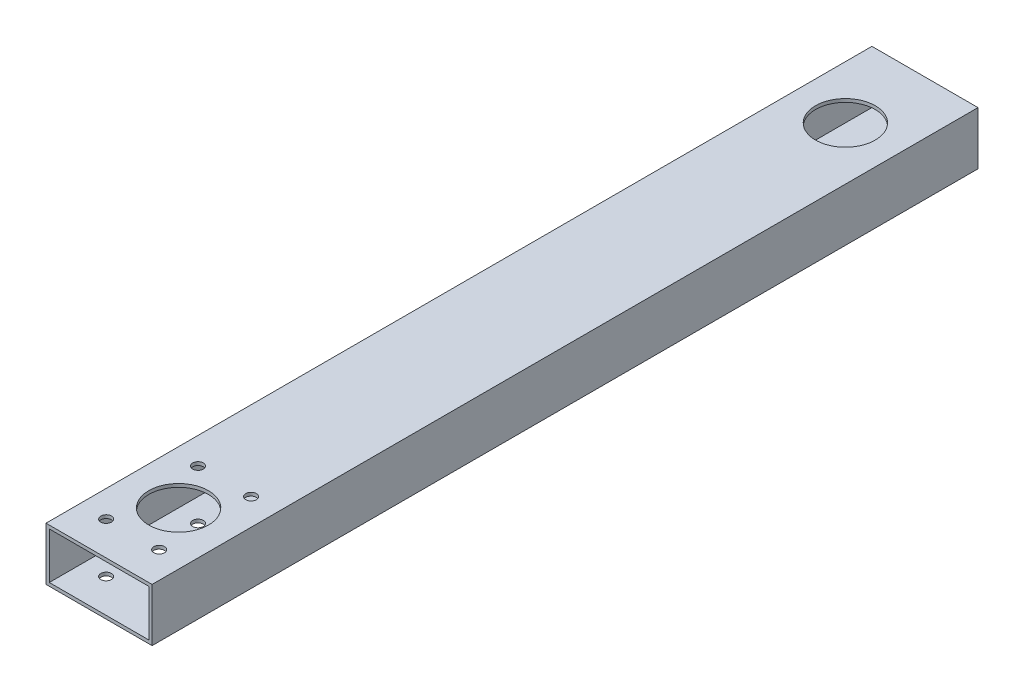
ISO-10303-21;
HEADER;
FILE_DESCRIPTION(('STEP AP214'),'2;1');
FILE_NAME('part.step','',(''),(''),'','','');
FILE_SCHEMA(('AUTOMOTIVE_DESIGN { 1 0 10303 214 1 1 1 1 }'));
ENDSEC;
DATA;
#1=APPLICATION_CONTEXT('core data for automotive mechanical design processes');
#2=APPLICATION_PROTOCOL_DEFINITION('international standard','automotive_design',2000,#1);
#3=PRODUCT_CONTEXT('',#1,'mechanical');
#4=PRODUCT('Part','Part','',(#3));
#5=PRODUCT_RELATED_PRODUCT_CATEGORY('part','',(#4));
#6=PRODUCT_DEFINITION_FORMATION('','',#4);
#7=PRODUCT_DEFINITION_CONTEXT('part definition',#1,'design');
#8=PRODUCT_DEFINITION('design','',#6,#7);
#9=PRODUCT_DEFINITION_SHAPE('','',#8);
#10=(LENGTH_UNIT() NAMED_UNIT(*) SI_UNIT(.MILLI.,.METRE.));
#11=(NAMED_UNIT(*) PLANE_ANGLE_UNIT() SI_UNIT($,.RADIAN.));
#12=(NAMED_UNIT(*) SI_UNIT($,.STERADIAN.) SOLID_ANGLE_UNIT());
#13=UNCERTAINTY_MEASURE_WITH_UNIT(LENGTH_MEASURE(1.E-05),#10,'distance_accuracy_value','');
#14=(GEOMETRIC_REPRESENTATION_CONTEXT(3) GLOBAL_UNCERTAINTY_ASSIGNED_CONTEXT((#13)) GLOBAL_UNIT_ASSIGNED_CONTEXT((#10,
#11,#12)) REPRESENTATION_CONTEXT('',''));
#15=CARTESIAN_POINT('',(0.,0.,0.));
#16=DIRECTION('',(0.,0.,1.));
#17=DIRECTION('',(1.,0.,0.));
#18=AXIS2_PLACEMENT_3D('',#15,#16,#17);
#19=CARTESIAN_POINT('',(655.574,1437.40214385304,555.397045256125));
#20=DIRECTION('',(0.,-1.,0.));
#21=DIRECTION('',(0.,0.,-1.));
#22=AXIS2_PLACEMENT_3D('',#19,#20,#21);
#23=CYLINDRICAL_SURFACE('',#22,2.55270000000004);
#24=CARTESIAN_POINT('',(655.574,-26.19375,555.397045256125));
#25=DIRECTION('',(0.,-1.,0.));
#26=DIRECTION('',(0.,0.,-1.));
#27=AXIS2_PLACEMENT_3D('',#24,#25,#26);
#28=CIRCLE('',#27,2.55270000000004);
#29=CARTESIAN_POINT('',(655.574,-26.19375,552.844345256125));
#30=VERTEX_POINT('',#29);
#31=EDGE_CURVE('E291',#30,#30,#28,.T.);
#32=ORIENTED_EDGE('',*,*,#31,.F.);
#33=EDGE_LOOP('',(#32));
#34=FACE_BOUND('',#33,.T.);
#35=CARTESIAN_POINT('',(655.574,-27.78125,555.397045256125));
#36=DIRECTION('',(0.,-1.,0.));
#37=DIRECTION('',(0.,0.,-1.));
#38=AXIS2_PLACEMENT_3D('',#35,#36,#37);
#39=CIRCLE('',#38,2.55270000000004);
#40=CARTESIAN_POINT('',(655.574,-27.78125,552.844345256125));
#41=VERTEX_POINT('',#40);
#42=EDGE_CURVE('E334',#41,#41,#39,.T.);
#43=ORIENTED_EDGE('',*,*,#42,.T.);
#44=EDGE_LOOP('',(#43));
#45=FACE_BOUND('',#44,.T.);
#46=ADVANCED_FACE('F17',(#34,#45),#23,.F.);
#47=CARTESIAN_POINT('',(680.974,1437.40214385304,555.397045256125));
#48=DIRECTION('',(0.,-1.,0.));
#49=DIRECTION('',(0.,0.,-1.));
#50=AXIS2_PLACEMENT_3D('',#47,#48,#49);
#51=CYLINDRICAL_SURFACE('',#50,2.55270000000004);
#52=CARTESIAN_POINT('',(680.974,-26.19375,555.397045256125));
#53=DIRECTION('',(0.,-1.,0.));
#54=DIRECTION('',(0.,0.,-1.));
#55=AXIS2_PLACEMENT_3D('',#52,#53,#54);
#56=CIRCLE('',#55,2.55270000000004);
#57=CARTESIAN_POINT('',(680.974,-26.19375,552.844345256125));
#58=VERTEX_POINT('',#57);
#59=EDGE_CURVE('E268',#58,#58,#56,.T.);
#60=ORIENTED_EDGE('',*,*,#59,.F.);
#61=EDGE_LOOP('',(#60));
#62=FACE_BOUND('',#61,.T.);
#63=CARTESIAN_POINT('',(680.974,-27.78125,555.397045256125));
#64=DIRECTION('',(0.,-1.,0.));
#65=DIRECTION('',(0.,0.,-1.));
#66=AXIS2_PLACEMENT_3D('',#63,#64,#65);
#67=CIRCLE('',#66,2.55270000000004);
#68=CARTESIAN_POINT('',(680.974,-27.78125,552.844345256125));
#69=VERTEX_POINT('',#68);
#70=EDGE_CURVE('E339',#69,#69,#67,.T.);
#71=ORIENTED_EDGE('',*,*,#70,.T.);
#72=EDGE_LOOP('',(#71));
#73=FACE_BOUND('',#72,.T.);
#74=ADVANCED_FACE('F402',(#62,#73),#51,.F.);
#75=CARTESIAN_POINT('',(680.974,1437.40214385304,511.402954743875));
#76=DIRECTION('',(0.,-1.,0.));
#77=DIRECTION('',(0.,0.,-1.));
#78=AXIS2_PLACEMENT_3D('',#75,#76,#77);
#79=CYLINDRICAL_SURFACE('',#78,2.55270000000004);
#80=CARTESIAN_POINT('',(680.974,-26.19375,511.402954743875));
#81=DIRECTION('',(0.,-1.,0.));
#82=DIRECTION('',(0.,0.,-1.));
#83=AXIS2_PLACEMENT_3D('',#80,#81,#82);
#84=CIRCLE('',#83,2.55270000000004);
#85=CARTESIAN_POINT('',(680.974,-26.19375,508.850254743875));
#86=VERTEX_POINT('',#85);
#87=EDGE_CURVE('E264',#86,#86,#84,.T.);
#88=ORIENTED_EDGE('',*,*,#87,.F.);
#89=EDGE_LOOP('',(#88));
#90=FACE_BOUND('',#89,.T.);
#91=CARTESIAN_POINT('',(680.974,-27.78125,511.402954743875));
#92=DIRECTION('',(0.,-1.,0.));
#93=DIRECTION('',(0.,0.,-1.));
#94=AXIS2_PLACEMENT_3D('',#91,#92,#93);
#95=CIRCLE('',#94,2.55270000000004);
#96=CARTESIAN_POINT('',(680.974,-27.78125,508.850254743875));
#97=VERTEX_POINT('',#96);
#98=EDGE_CURVE('E342',#97,#97,#95,.T.);
#99=ORIENTED_EDGE('',*,*,#98,.T.);
#100=EDGE_LOOP('',(#99));
#101=FACE_BOUND('',#100,.T.);
#102=ADVANCED_FACE('F407',(#90,#101),#79,.F.);
#103=CARTESIAN_POINT('',(655.574,1437.40214385304,511.402954743875));
#104=DIRECTION('',(0.,-1.,0.));
#105=DIRECTION('',(0.,0.,-1.));
#106=AXIS2_PLACEMENT_3D('',#103,#104,#105);
#107=CYLINDRICAL_SURFACE('',#106,2.55270000000004);
#108=CARTESIAN_POINT('',(655.574,-26.19375,511.402954743875));
#109=DIRECTION('',(0.,-1.,0.));
#110=DIRECTION('',(0.,0.,-1.));
#111=AXIS2_PLACEMENT_3D('',#108,#109,#110);
#112=CIRCLE('',#111,2.55270000000004);
#113=CARTESIAN_POINT('',(655.574,-26.19375,508.850254743875));
#114=VERTEX_POINT('',#113);
#115=EDGE_CURVE('E267',#114,#114,#112,.T.);
#116=ORIENTED_EDGE('',*,*,#115,.F.);
#117=EDGE_LOOP('',(#116));
#118=FACE_BOUND('',#117,.T.);
#119=CARTESIAN_POINT('',(655.574,-27.78125,511.402954743875));
#120=DIRECTION('',(0.,-1.,0.));
#121=DIRECTION('',(0.,0.,-1.));
#122=AXIS2_PLACEMENT_3D('',#119,#120,#121);
#123=CIRCLE('',#122,2.55270000000004);
#124=CARTESIAN_POINT('',(655.574,-27.78125,508.850254743875));
#125=VERTEX_POINT('',#124);
#126=EDGE_CURVE('E345',#125,#125,#123,.T.);
#127=ORIENTED_EDGE('',*,*,#126,.T.);
#128=EDGE_LOOP('',(#127));
#129=FACE_BOUND('',#128,.T.);
#130=ADVANCED_FACE('F444',(#118,#129),#107,.F.);
#131=CARTESIAN_POINT('',(668.274,1437.40214385304,533.4));
#132=DIRECTION('',(0.,-1.,0.));
#133=DIRECTION('',(0.,0.,-1.));
#134=AXIS2_PLACEMENT_3D('',#131,#132,#133);
#135=CYLINDRICAL_SURFACE('',#134,14.2875);
#136=CARTESIAN_POINT('',(668.274,-26.19375,533.4));
#137=DIRECTION('',(0.,-1.,0.));
#138=DIRECTION('',(0.,0.,-1.));
#139=AXIS2_PLACEMENT_3D('',#136,#137,#138);
#140=CIRCLE('',#139,14.2875);
#141=CARTESIAN_POINT('',(668.274,-26.19375,519.1125));
#142=VERTEX_POINT('',#141);
#143=EDGE_CURVE('E303',#142,#142,#140,.T.);
#144=ORIENTED_EDGE('',*,*,#143,.F.);
#145=EDGE_LOOP('',(#144));
#146=FACE_BOUND('',#145,.T.);
#147=CARTESIAN_POINT('',(668.274,-27.78125,533.4));
#148=DIRECTION('',(0.,-1.,0.));
#149=DIRECTION('',(0.,0.,-1.));
#150=AXIS2_PLACEMENT_3D('',#147,#148,#149);
#151=CIRCLE('',#150,14.2875);
#152=CARTESIAN_POINT('',(668.274,-27.78125,519.1125));
#153=VERTEX_POINT('',#152);
#154=EDGE_CURVE('E348',#153,#153,#151,.T.);
#155=ORIENTED_EDGE('',*,*,#154,.T.);
#156=EDGE_LOOP('',(#155));
#157=FACE_BOUND('',#156,.T.);
#158=ADVANCED_FACE('F395',(#146,#157),#135,.F.);
#159=CARTESIAN_POINT('',(668.274,1437.40214385304,214.122));
#160=DIRECTION('',(0.,-1.,0.));
#161=DIRECTION('',(0.,0.,-1.));
#162=AXIS2_PLACEMENT_3D('',#159,#160,#161);
#163=CYLINDRICAL_SURFACE('',#162,14.2875);
#164=CARTESIAN_POINT('',(668.274,-26.19375,214.122));
#165=DIRECTION('',(0.,-1.,0.));
#166=DIRECTION('',(0.,0.,-1.));
#167=AXIS2_PLACEMENT_3D('',#164,#165,#166);
#168=CIRCLE('',#167,14.2875);
#169=CARTESIAN_POINT('',(668.274,-26.19375,199.8345));
#170=VERTEX_POINT('',#169);
#171=EDGE_CURVE('E306',#170,#170,#168,.T.);
#172=ORIENTED_EDGE('',*,*,#171,.F.);
#173=EDGE_LOOP('',(#172));
#174=FACE_BOUND('',#173,.T.);
#175=CARTESIAN_POINT('',(668.274,-27.78125,214.122));
#176=DIRECTION('',(0.,-1.,0.));
#177=DIRECTION('',(0.,0.,-1.));
#178=AXIS2_PLACEMENT_3D('',#175,#176,#177);
#179=CIRCLE('',#178,14.2875);
#180=CARTESIAN_POINT('',(668.274,-27.78125,199.8345));
#181=VERTEX_POINT('',#180);
#182=EDGE_CURVE('E351',#181,#181,#179,.T.);
#183=ORIENTED_EDGE('',*,*,#182,.T.);
#184=EDGE_LOOP('',(#183));
#185=FACE_BOUND('',#184,.T.);
#186=ADVANCED_FACE('F385',(#174,#185),#163,.F.);
#187=CARTESIAN_POINT('',(655.574,1437.40214385304,555.397045256125));
#188=DIRECTION('',(0.,-1.,0.));
#189=DIRECTION('',(0.,0.,-1.));
#190=AXIS2_PLACEMENT_3D('',#187,#188,#189);
#191=CYLINDRICAL_SURFACE('',#190,2.55270000000004);
#192=CARTESIAN_POINT('',(655.574,-50.00625,555.397045256125));
#193=DIRECTION('',(0.,-1.,0.));
#194=DIRECTION('',(0.,0.,-1.));
#195=AXIS2_PLACEMENT_3D('',#192,#193,#194);
#196=CIRCLE('',#195,2.55270000000004);
#197=CARTESIAN_POINT('',(655.574,-50.00625,552.844345256125));
#198=VERTEX_POINT('',#197);
#199=EDGE_CURVE('E354',#198,#198,#196,.T.);
#200=ORIENTED_EDGE('',*,*,#199,.F.);
#201=EDGE_LOOP('',(#200));
#202=FACE_BOUND('',#201,.T.);
#203=CARTESIAN_POINT('',(655.574,-51.59375,555.397045256125));
#204=DIRECTION('',(0.,-1.,0.));
#205=DIRECTION('',(0.,0.,-1.));
#206=AXIS2_PLACEMENT_3D('',#203,#204,#205);
#207=CIRCLE('',#206,2.55270000000004);
#208=CARTESIAN_POINT('',(655.574,-51.59375,552.844345256125));
#209=VERTEX_POINT('',#208);
#210=EDGE_CURVE('E309',#209,#209,#207,.T.);
#211=ORIENTED_EDGE('',*,*,#210,.T.);
#212=EDGE_LOOP('',(#211));
#213=FACE_BOUND('',#212,.T.);
#214=ADVANCED_FACE('F383',(#202,#213),#191,.F.);
#215=CARTESIAN_POINT('',(680.974,1437.40214385304,555.397045256125));
#216=DIRECTION('',(0.,-1.,0.));
#217=DIRECTION('',(0.,0.,-1.));
#218=AXIS2_PLACEMENT_3D('',#215,#216,#217);
#219=CYLINDRICAL_SURFACE('',#218,2.55270000000004);
#220=CARTESIAN_POINT('',(680.974,-50.00625,555.397045256125));
#221=DIRECTION('',(0.,-1.,0.));
#222=DIRECTION('',(0.,0.,-1.));
#223=AXIS2_PLACEMENT_3D('',#220,#221,#222);
#224=CIRCLE('',#223,2.55270000000004);
#225=CARTESIAN_POINT('',(680.974,-50.00625,552.844345256125));
#226=VERTEX_POINT('',#225);
#227=EDGE_CURVE('E357',#226,#226,#224,.T.);
#228=ORIENTED_EDGE('',*,*,#227,.F.);
#229=EDGE_LOOP('',(#228));
#230=FACE_BOUND('',#229,.T.);
#231=CARTESIAN_POINT('',(680.974,-51.59375,555.397045256125));
#232=DIRECTION('',(0.,-1.,0.));
#233=DIRECTION('',(0.,0.,-1.));
#234=AXIS2_PLACEMENT_3D('',#231,#232,#233);
#235=CIRCLE('',#234,2.55270000000004);
#236=CARTESIAN_POINT('',(680.974,-51.59375,552.844345256125));
#237=VERTEX_POINT('',#236);
#238=EDGE_CURVE('E300',#237,#237,#235,.T.);
#239=ORIENTED_EDGE('',*,*,#238,.T.);
#240=EDGE_LOOP('',(#239));
#241=FACE_BOUND('',#240,.T.);
#242=ADVANCED_FACE('F370',(#230,#241),#219,.F.);
#243=CARTESIAN_POINT('',(680.974,1437.40214385304,511.402954743875));
#244=DIRECTION('',(0.,-1.,0.));
#245=DIRECTION('',(0.,0.,-1.));
#246=AXIS2_PLACEMENT_3D('',#243,#244,#245);
#247=CYLINDRICAL_SURFACE('',#246,2.55270000000004);
#248=CARTESIAN_POINT('',(680.974,-50.00625,511.402954743875));
#249=DIRECTION('',(0.,-1.,0.));
#250=DIRECTION('',(0.,0.,-1.));
#251=AXIS2_PLACEMENT_3D('',#248,#249,#250);
#252=CIRCLE('',#251,2.55270000000004);
#253=CARTESIAN_POINT('',(680.974,-50.00625,508.850254743875));
#254=VERTEX_POINT('',#253);
#255=EDGE_CURVE('E237',#254,#254,#252,.T.);
#256=ORIENTED_EDGE('',*,*,#255,.F.);
#257=EDGE_LOOP('',(#256));
#258=FACE_BOUND('',#257,.T.);
#259=CARTESIAN_POINT('',(680.974,-51.59375,511.402954743875));
#260=DIRECTION('',(0.,-1.,0.));
#261=DIRECTION('',(0.,0.,-1.));
#262=AXIS2_PLACEMENT_3D('',#259,#260,#261);
#263=CIRCLE('',#262,2.55270000000004);
#264=CARTESIAN_POINT('',(680.974,-51.59375,508.850254743875));
#265=VERTEX_POINT('',#264);
#266=EDGE_CURVE('E296',#265,#265,#263,.T.);
#267=ORIENTED_EDGE('',*,*,#266,.T.);
#268=EDGE_LOOP('',(#267));
#269=FACE_BOUND('',#268,.T.);
#270=ADVANCED_FACE('F366',(#258,#269),#247,.F.);
#271=CARTESIAN_POINT('',(655.574,1437.40214385304,511.402954743875));
#272=DIRECTION('',(0.,-1.,0.));
#273=DIRECTION('',(0.,0.,-1.));
#274=AXIS2_PLACEMENT_3D('',#271,#272,#273);
#275=CYLINDRICAL_SURFACE('',#274,2.55270000000004);
#276=CARTESIAN_POINT('',(655.574,-50.00625,511.402954743875));
#277=DIRECTION('',(0.,-1.,0.));
#278=DIRECTION('',(0.,0.,-1.));
#279=AXIS2_PLACEMENT_3D('',#276,#277,#278);
#280=CIRCLE('',#279,2.55270000000004);
#281=CARTESIAN_POINT('',(655.574,-50.00625,508.850254743875));
#282=VERTEX_POINT('',#281);
#283=EDGE_CURVE('E235',#282,#282,#280,.T.);
#284=ORIENTED_EDGE('',*,*,#283,.F.);
#285=EDGE_LOOP('',(#284));
#286=FACE_BOUND('',#285,.T.);
#287=CARTESIAN_POINT('',(655.574,-51.59375,511.402954743875));
#288=DIRECTION('',(0.,-1.,0.));
#289=DIRECTION('',(0.,0.,-1.));
#290=AXIS2_PLACEMENT_3D('',#287,#288,#289);
#291=CIRCLE('',#290,2.55270000000004);
#292=CARTESIAN_POINT('',(655.574,-51.59375,508.850254743875));
#293=VERTEX_POINT('',#292);
#294=EDGE_CURVE('E299',#293,#293,#291,.T.);
#295=ORIENTED_EDGE('',*,*,#294,.T.);
#296=EDGE_LOOP('',(#295));
#297=FACE_BOUND('',#296,.T.);
#298=ADVANCED_FACE('F369',(#286,#297),#275,.F.);
#299=CARTESIAN_POINT('',(668.274,1437.40214385304,533.4));
#300=DIRECTION('',(0.,-1.,0.));
#301=DIRECTION('',(0.,0.,-1.));
#302=AXIS2_PLACEMENT_3D('',#299,#300,#301);
#303=CYLINDRICAL_SURFACE('',#302,14.2875);
#304=CARTESIAN_POINT('',(668.274,-50.00625,533.4));
#305=DIRECTION('',(0.,-1.,0.));
#306=DIRECTION('',(0.,0.,-1.));
#307=AXIS2_PLACEMENT_3D('',#304,#305,#306);
#308=CIRCLE('',#307,14.2875);
#309=CARTESIAN_POINT('',(668.274,-50.00625,519.1125));
#310=VERTEX_POINT('',#309);
#311=EDGE_CURVE('E25',#310,#310,#308,.T.);
#312=ORIENTED_EDGE('',*,*,#311,.F.);
#313=EDGE_LOOP('',(#312));
#314=FACE_BOUND('',#313,.T.);
#315=CARTESIAN_POINT('',(668.274,-51.59375,533.4));
#316=DIRECTION('',(0.,-1.,0.));
#317=DIRECTION('',(0.,0.,-1.));
#318=AXIS2_PLACEMENT_3D('',#315,#316,#317);
#319=CIRCLE('',#318,14.2875);
#320=CARTESIAN_POINT('',(668.274,-51.59375,519.1125));
#321=VERTEX_POINT('',#320);
#322=EDGE_CURVE('E310',#321,#321,#319,.T.);
#323=ORIENTED_EDGE('',*,*,#322,.T.);
#324=EDGE_LOOP('',(#323));
#325=FACE_BOUND('',#324,.T.);
#326=ADVANCED_FACE('F433',(#314,#325),#303,.F.);
#327=CARTESIAN_POINT('',(668.274,1437.40214385304,214.122));
#328=DIRECTION('',(0.,-1.,0.));
#329=DIRECTION('',(0.,0.,-1.));
#330=AXIS2_PLACEMENT_3D('',#327,#328,#329);
#331=CYLINDRICAL_SURFACE('',#330,14.2875);
#332=CARTESIAN_POINT('',(668.274,-50.00625,214.122));
#333=DIRECTION('',(0.,-1.,0.));
#334=DIRECTION('',(0.,0.,-1.));
#335=AXIS2_PLACEMENT_3D('',#332,#333,#334);
#336=CIRCLE('',#335,14.2875);
#337=CARTESIAN_POINT('',(668.274,-50.00625,199.8345));
#338=VERTEX_POINT('',#337);
#339=EDGE_CURVE('E11',#338,#338,#336,.T.);
#340=ORIENTED_EDGE('',*,*,#339,.F.);
#341=EDGE_LOOP('',(#340));
#342=FACE_BOUND('',#341,.T.);
#343=CARTESIAN_POINT('',(668.274,-51.59375,214.122));
#344=DIRECTION('',(0.,-1.,0.));
#345=DIRECTION('',(0.,0.,-1.));
#346=AXIS2_PLACEMENT_3D('',#343,#344,#345);
#347=CIRCLE('',#346,14.2875);
#348=CARTESIAN_POINT('',(668.274,-51.59375,199.8345));
#349=VERTEX_POINT('',#348);
#350=EDGE_CURVE('E313',#349,#349,#347,.T.);
#351=ORIENTED_EDGE('',*,*,#350,.T.);
#352=EDGE_LOOP('',(#351));
#353=FACE_BOUND('',#352,.T.);
#354=ADVANCED_FACE('F424',(#342,#353),#331,.F.);
#355=CARTESIAN_POINT('',(564.7055,-50.00625,481.683357143497));
#356=DIRECTION('',(0.,-1.,0.));
#357=DIRECTION('',(0.,0.,-1.));
#358=AXIS2_PLACEMENT_3D('',#355,#356,#357);
#359=PLANE('',#358);
#360=DIRECTION('',(0.,0.,-1.));
#361=VECTOR('',#360,1.);
#362=CARTESIAN_POINT('',(644.4615,-50.00625,481.683357143497));
#363=LINE('',#362,#361);
#364=CARTESIAN_POINT('',(644.4615,-50.00625,571.5));
#365=VERTEX_POINT('',#364);
#366=CARTESIAN_POINT('',(644.4615,-50.00625,176.022));
#367=VERTEX_POINT('',#366);
#368=EDGE_CURVE('E322',#365,#367,#363,.T.);
#369=ORIENTED_EDGE('',*,*,#368,.F.);
#370=DIRECTION('',(1.,0.,0.));
#371=VECTOR('',#370,1.);
#372=CARTESIAN_POINT('',(564.7055,-50.00625,571.5));
#373=LINE('',#372,#371);
#374=CARTESIAN_POINT('',(692.0865,-50.00625,571.5));
#375=VERTEX_POINT('',#374);
#376=EDGE_CURVE('E250',#365,#375,#373,.T.);
#377=ORIENTED_EDGE('',*,*,#376,.T.);
#378=DIRECTION('',(0.,0.,-1.));
#379=VECTOR('',#378,1.);
#380=CARTESIAN_POINT('',(692.0865,-50.00625,481.683357143497));
#381=LINE('',#380,#379);
#382=CARTESIAN_POINT('',(692.0865,-50.00625,176.022));
#383=VERTEX_POINT('',#382);
#384=EDGE_CURVE('E328',#375,#383,#381,.T.);
#385=ORIENTED_EDGE('',*,*,#384,.T.);
#386=DIRECTION('',(1.,0.,0.));
#387=VECTOR('',#386,1.);
#388=CARTESIAN_POINT('',(564.7055,-50.00625,176.022));
#389=LINE('',#388,#387);
#390=EDGE_CURVE('E249',#367,#383,#389,.T.);
#391=ORIENTED_EDGE('',*,*,#390,.F.);
#392=EDGE_LOOP('',(#369,#377,#385,#391));
#393=FACE_BOUND('',#392,.T.);
#394=ORIENTED_EDGE('',*,*,#339,.T.);
#395=EDGE_LOOP('',(#394));
#396=FACE_BOUND('',#395,.T.);
#397=ORIENTED_EDGE('',*,*,#311,.T.);
#398=EDGE_LOOP('',(#397));
#399=FACE_BOUND('',#398,.T.);
#400=ORIENTED_EDGE('',*,*,#283,.T.);
#401=EDGE_LOOP('',(#400));
#402=FACE_BOUND('',#401,.T.);
#403=ORIENTED_EDGE('',*,*,#255,.T.);
#404=EDGE_LOOP('',(#403));
#405=FACE_BOUND('',#404,.T.);
#406=ORIENTED_EDGE('',*,*,#227,.T.);
#407=EDGE_LOOP('',(#406));
#408=FACE_BOUND('',#407,.T.);
#409=ORIENTED_EDGE('',*,*,#199,.T.);
#410=EDGE_LOOP('',(#409));
#411=FACE_BOUND('',#410,.T.);
#412=ADVANCED_FACE('F363',(#393,#396,#399,#402,#405,#408,#411),#359,.F.);
#413=CARTESIAN_POINT('',(564.7055,-27.78125,481.683357143497));
#414=DIRECTION('',(0.,-1.,0.));
#415=DIRECTION('',(0.,0.,-1.));
#416=AXIS2_PLACEMENT_3D('',#413,#414,#415);
#417=PLANE('',#416);
#418=DIRECTION('',(0.,0.,-1.));
#419=VECTOR('',#418,1.);
#420=CARTESIAN_POINT('',(644.4615,-27.78125,481.683357143497));
#421=LINE('',#420,#419);
#422=CARTESIAN_POINT('',(644.4615,-27.78125,571.5));
#423=VERTEX_POINT('',#422);
#424=CARTESIAN_POINT('',(644.4615,-27.78125,176.022));
#425=VERTEX_POINT('',#424);
#426=EDGE_CURVE('E325',#423,#425,#421,.T.);
#427=ORIENTED_EDGE('',*,*,#426,.T.);
#428=DIRECTION('',(1.,0.,0.));
#429=VECTOR('',#428,1.);
#430=CARTESIAN_POINT('',(564.7055,-27.78125,176.022));
#431=LINE('',#430,#429);
#432=CARTESIAN_POINT('',(692.0865,-27.78125,176.022));
#433=VERTEX_POINT('',#432);
#434=EDGE_CURVE('E263',#425,#433,#431,.T.);
#435=ORIENTED_EDGE('',*,*,#434,.T.);
#436=DIRECTION('',(0.,0.,-1.));
#437=VECTOR('',#436,1.);
#438=CARTESIAN_POINT('',(692.0865,-27.78125,481.683357143497));
#439=LINE('',#438,#437);
#440=CARTESIAN_POINT('',(692.0865,-27.78125,571.5));
#441=VERTEX_POINT('',#440);
#442=EDGE_CURVE('E331',#441,#433,#439,.T.);
#443=ORIENTED_EDGE('',*,*,#442,.F.);
#444=DIRECTION('',(1.,0.,0.));
#445=VECTOR('',#444,1.);
#446=CARTESIAN_POINT('',(564.7055,-27.78125,571.5));
#447=LINE('',#446,#445);
#448=EDGE_CURVE('E234',#423,#441,#447,.T.);
#449=ORIENTED_EDGE('',*,*,#448,.F.);
#450=EDGE_LOOP('',(#427,#435,#443,#449));
#451=FACE_BOUND('',#450,.T.);
#452=ORIENTED_EDGE('',*,*,#182,.F.);
#453=EDGE_LOOP('',(#452));
#454=FACE_BOUND('',#453,.T.);
#455=ORIENTED_EDGE('',*,*,#154,.F.);
#456=EDGE_LOOP('',(#455));
#457=FACE_BOUND('',#456,.T.);
#458=ORIENTED_EDGE('',*,*,#126,.F.);
#459=EDGE_LOOP('',(#458));
#460=FACE_BOUND('',#459,.T.);
#461=ORIENTED_EDGE('',*,*,#98,.F.);
#462=EDGE_LOOP('',(#461));
#463=FACE_BOUND('',#462,.T.);
#464=ORIENTED_EDGE('',*,*,#70,.F.);
#465=EDGE_LOOP('',(#464));
#466=FACE_BOUND('',#465,.T.);
#467=ORIENTED_EDGE('',*,*,#42,.F.);
#468=EDGE_LOOP('',(#467));
#469=FACE_BOUND('',#468,.T.);
#470=ADVANCED_FACE('F413',(#451,#454,#457,#460,#463,#466,#469),#417,.T.);
#471=CARTESIAN_POINT('',(692.0865,-26.19375,373.761));
#472=DIRECTION('',(-1.,0.,0.));
#473=DIRECTION('',(0.,0.,1.));
#474=AXIS2_PLACEMENT_3D('',#471,#472,#473);
#475=PLANE('',#474);
#476=ORIENTED_EDGE('',*,*,#384,.F.);
#477=DIRECTION('',(0.,-1.,0.));
#478=VECTOR('',#477,1.);
#479=CARTESIAN_POINT('',(692.0865,-26.19375,571.5));
#480=LINE('',#479,#478);
#481=EDGE_CURVE('E240',#441,#375,#480,.T.);
#482=ORIENTED_EDGE('',*,*,#481,.F.);
#483=ORIENTED_EDGE('',*,*,#442,.T.);
#484=DIRECTION('',(0.,-1.,0.));
#485=VECTOR('',#484,1.);
#486=CARTESIAN_POINT('',(692.0865,-26.19375,176.022));
#487=LINE('',#486,#485);
#488=EDGE_CURVE('E259',#433,#383,#487,.T.);
#489=ORIENTED_EDGE('',*,*,#488,.T.);
#490=EDGE_LOOP('',(#476,#482,#483,#489));
#491=FACE_BOUND('',#490,.T.);
#492=ADVANCED_FACE('F415',(#491),#475,.T.);
#493=CARTESIAN_POINT('',(644.4615,-26.19375,373.761));
#494=DIRECTION('',(-1.,0.,0.));
#495=DIRECTION('',(0.,0.,1.));
#496=AXIS2_PLACEMENT_3D('',#493,#494,#495);
#497=PLANE('',#496);
#498=ORIENTED_EDGE('',*,*,#368,.T.);
#499=DIRECTION('',(0.,-1.,0.));
#500=VECTOR('',#499,1.);
#501=CARTESIAN_POINT('',(644.4615,-26.19375,176.022));
#502=LINE('',#501,#500);
#503=EDGE_CURVE('E218',#425,#367,#502,.T.);
#504=ORIENTED_EDGE('',*,*,#503,.F.);
#505=ORIENTED_EDGE('',*,*,#426,.F.);
#506=DIRECTION('',(0.,-1.,0.));
#507=VECTOR('',#506,1.);
#508=CARTESIAN_POINT('',(644.4615,-26.19375,571.5));
#509=LINE('',#508,#507);
#510=EDGE_CURVE('E254',#423,#365,#509,.T.);
#511=ORIENTED_EDGE('',*,*,#510,.T.);
#512=EDGE_LOOP('',(#498,#504,#505,#511));
#513=FACE_BOUND('',#512,.T.);
#514=ADVANCED_FACE('F377',(#513),#497,.F.);
#515=CARTESIAN_POINT('',(564.7055,-51.59375,481.683357143497));
#516=DIRECTION('',(0.,-1.,0.));
#517=DIRECTION('',(0.,0.,-1.));
#518=AXIS2_PLACEMENT_3D('',#515,#516,#517);
#519=PLANE('',#518);
#520=DIRECTION('',(0.,0.,-1.));
#521=VECTOR('',#520,1.);
#522=CARTESIAN_POINT('',(642.874,-51.59375,373.761));
#523=LINE('',#522,#521);
#524=CARTESIAN_POINT('',(642.874,-51.59375,571.5));
#525=VERTEX_POINT('',#524);
#526=CARTESIAN_POINT('',(642.874,-51.59375,176.022));
#527=VERTEX_POINT('',#526);
#528=EDGE_CURVE('E222',#525,#527,#523,.T.);
#529=ORIENTED_EDGE('',*,*,#528,.T.);
#530=DIRECTION('',(1.,0.,0.));
#531=VECTOR('',#530,1.);
#532=CARTESIAN_POINT('',(668.274,-51.59375,176.022));
#533=LINE('',#532,#531);
#534=CARTESIAN_POINT('',(693.674,-51.59375,176.022));
#535=VERTEX_POINT('',#534);
#536=EDGE_CURVE('E214',#527,#535,#533,.T.);
#537=ORIENTED_EDGE('',*,*,#536,.T.);
#538=DIRECTION('',(0.,0.,-1.));
#539=VECTOR('',#538,1.);
#540=CARTESIAN_POINT('',(693.674,-51.59375,373.761));
#541=LINE('',#540,#539);
#542=CARTESIAN_POINT('',(693.674,-51.59375,571.5));
#543=VERTEX_POINT('',#542);
#544=EDGE_CURVE('E195',#543,#535,#541,.T.);
#545=ORIENTED_EDGE('',*,*,#544,.F.);
#546=DIRECTION('',(1.,0.,0.));
#547=VECTOR('',#546,1.);
#548=CARTESIAN_POINT('',(668.274,-51.59375,571.5));
#549=LINE('',#548,#547);
#550=EDGE_CURVE('E272',#525,#543,#549,.T.);
#551=ORIENTED_EDGE('',*,*,#550,.F.);
#552=EDGE_LOOP('',(#529,#537,#545,#551));
#553=FACE_BOUND('',#552,.T.);
#554=ORIENTED_EDGE('',*,*,#350,.F.);
#555=EDGE_LOOP('',(#554));
#556=FACE_BOUND('',#555,.T.);
#557=ORIENTED_EDGE('',*,*,#322,.F.);
#558=EDGE_LOOP('',(#557));
#559=FACE_BOUND('',#558,.T.);
#560=ORIENTED_EDGE('',*,*,#294,.F.);
#561=EDGE_LOOP('',(#560));
#562=FACE_BOUND('',#561,.T.);
#563=ORIENTED_EDGE('',*,*,#266,.F.);
#564=EDGE_LOOP('',(#563));
#565=FACE_BOUND('',#564,.T.);
#566=ORIENTED_EDGE('',*,*,#238,.F.);
#567=EDGE_LOOP('',(#566));
#568=FACE_BOUND('',#567,.T.);
#569=ORIENTED_EDGE('',*,*,#210,.F.);
#570=EDGE_LOOP('',(#569));
#571=FACE_BOUND('',#570,.T.);
#572=ADVANCED_FACE('F220',(#553,#556,#559,#562,#565,#568,#571),#519,.T.);
#573=CARTESIAN_POINT('',(564.7055,-26.19375,481.683357143497));
#574=DIRECTION('',(0.,-1.,0.));
#575=DIRECTION('',(0.,0.,-1.));
#576=AXIS2_PLACEMENT_3D('',#573,#574,#575);
#577=PLANE('',#576);
#578=DIRECTION('',(0.,0.,-1.));
#579=VECTOR('',#578,1.);
#580=CARTESIAN_POINT('',(642.874,-26.19375,373.761));
#581=LINE('',#580,#579);
#582=CARTESIAN_POINT('',(642.874,-26.19375,571.5));
#583=VERTEX_POINT('',#582);
#584=CARTESIAN_POINT('',(642.874,-26.19375,176.022));
#585=VERTEX_POINT('',#584);
#586=EDGE_CURVE('E208',#583,#585,#581,.T.);
#587=ORIENTED_EDGE('',*,*,#586,.F.);
#588=DIRECTION('',(1.,0.,0.));
#589=VECTOR('',#588,1.);
#590=CARTESIAN_POINT('',(668.274,-26.19375,571.5));
#591=LINE('',#590,#589);
#592=CARTESIAN_POINT('',(693.674,-26.19375,571.5));
#593=VERTEX_POINT('',#592);
#594=EDGE_CURVE('E275',#583,#593,#591,.T.);
#595=ORIENTED_EDGE('',*,*,#594,.T.);
#596=DIRECTION('',(0.,0.,-1.));
#597=VECTOR('',#596,1.);
#598=CARTESIAN_POINT('',(693.674,-26.19375,373.761));
#599=LINE('',#598,#597);
#600=CARTESIAN_POINT('',(693.674,-26.19375,176.022));
#601=VERTEX_POINT('',#600);
#602=EDGE_CURVE('E207',#593,#601,#599,.T.);
#603=ORIENTED_EDGE('',*,*,#602,.T.);
#604=DIRECTION('',(1.,0.,0.));
#605=VECTOR('',#604,1.);
#606=CARTESIAN_POINT('',(668.274,-26.19375,176.022));
#607=LINE('',#606,#605);
#608=EDGE_CURVE('E216',#585,#601,#607,.T.);
#609=ORIENTED_EDGE('',*,*,#608,.F.);
#610=EDGE_LOOP('',(#587,#595,#603,#609));
#611=FACE_BOUND('',#610,.T.);
#612=ORIENTED_EDGE('',*,*,#171,.T.);
#613=EDGE_LOOP('',(#612));
#614=FACE_BOUND('',#613,.T.);
#615=ORIENTED_EDGE('',*,*,#143,.T.);
#616=EDGE_LOOP('',(#615));
#617=FACE_BOUND('',#616,.T.);
#618=ORIENTED_EDGE('',*,*,#115,.T.);
#619=EDGE_LOOP('',(#618));
#620=FACE_BOUND('',#619,.T.);
#621=ORIENTED_EDGE('',*,*,#87,.T.);
#622=EDGE_LOOP('',(#621));
#623=FACE_BOUND('',#622,.T.);
#624=ORIENTED_EDGE('',*,*,#59,.T.);
#625=EDGE_LOOP('',(#624));
#626=FACE_BOUND('',#625,.T.);
#627=ORIENTED_EDGE('',*,*,#31,.T.);
#628=EDGE_LOOP('',(#627));
#629=FACE_BOUND('',#628,.T.);
#630=ADVANCED_FACE('F376',(#611,#614,#617,#620,#623,#626,#629),#577,.F.);
#631=CARTESIAN_POINT('',(693.674,-26.19375,373.761));
#632=DIRECTION('',(-1.,0.,0.));
#633=DIRECTION('',(0.,0.,1.));
#634=AXIS2_PLACEMENT_3D('',#631,#632,#633);
#635=PLANE('',#634);
#636=ORIENTED_EDGE('',*,*,#544,.T.);
#637=DIRECTION('',(0.,-1.,0.));
#638=VECTOR('',#637,1.);
#639=CARTESIAN_POINT('',(693.674,-26.19375,176.022));
#640=LINE('',#639,#638);
#641=EDGE_CURVE('E198',#601,#535,#640,.T.);
#642=ORIENTED_EDGE('',*,*,#641,.F.);
#643=ORIENTED_EDGE('',*,*,#602,.F.);
#644=DIRECTION('',(0.,-1.,0.));
#645=VECTOR('',#644,1.);
#646=CARTESIAN_POINT('',(693.674,-26.19375,571.5));
#647=LINE('',#646,#645);
#648=EDGE_CURVE('E201',#593,#543,#647,.T.);
#649=ORIENTED_EDGE('',*,*,#648,.T.);
#650=EDGE_LOOP('',(#636,#642,#643,#649));
#651=FACE_BOUND('',#650,.T.);
#652=ADVANCED_FACE('F197',(#651),#635,.F.);
#653=CARTESIAN_POINT('',(642.874,-26.19375,373.761));
#654=DIRECTION('',(-1.,0.,0.));
#655=DIRECTION('',(0.,0.,1.));
#656=AXIS2_PLACEMENT_3D('',#653,#654,#655);
#657=PLANE('',#656);
#658=ORIENTED_EDGE('',*,*,#528,.F.);
#659=DIRECTION('',(0.,-1.,0.));
#660=VECTOR('',#659,1.);
#661=CARTESIAN_POINT('',(642.874,-26.19375,571.5));
#662=LINE('',#661,#660);
#663=EDGE_CURVE('E255',#583,#525,#662,.T.);
#664=ORIENTED_EDGE('',*,*,#663,.F.);
#665=ORIENTED_EDGE('',*,*,#586,.T.);
#666=DIRECTION('',(0.,-1.,0.));
#667=VECTOR('',#666,1.);
#668=CARTESIAN_POINT('',(642.874,-26.19375,176.022));
#669=LINE('',#668,#667);
#670=EDGE_CURVE('E225',#585,#527,#669,.T.);
#671=ORIENTED_EDGE('',*,*,#670,.T.);
#672=EDGE_LOOP('',(#658,#664,#665,#671));
#673=FACE_BOUND('',#672,.T.);
#674=ADVANCED_FACE('F470',(#673),#657,.T.);
#675=CARTESIAN_POINT('',(668.274,-26.19375,571.5));
#676=DIRECTION('',(0.,0.,-1.));
#677=DIRECTION('',(0.,-1.,0.));
#678=AXIS2_PLACEMENT_3D('',#675,#676,#677);
#679=PLANE('',#678);
#680=ORIENTED_EDGE('',*,*,#376,.F.);
#681=ORIENTED_EDGE('',*,*,#510,.F.);
#682=ORIENTED_EDGE('',*,*,#448,.T.);
#683=ORIENTED_EDGE('',*,*,#481,.T.);
#684=EDGE_LOOP('',(#680,#681,#682,#683));
#685=FACE_BOUND('',#684,.T.);
#686=ORIENTED_EDGE('',*,*,#550,.T.);
#687=ORIENTED_EDGE('',*,*,#648,.F.);
#688=ORIENTED_EDGE('',*,*,#594,.F.);
#689=ORIENTED_EDGE('',*,*,#663,.T.);
#690=EDGE_LOOP('',(#686,#687,#688,#689));
#691=FACE_BOUND('',#690,.T.);
#692=ADVANCED_FACE('F475',(#685,#691),#679,.F.);
#693=CARTESIAN_POINT('',(668.274,-26.19375,176.022));
#694=DIRECTION('',(0.,0.,-1.));
#695=DIRECTION('',(0.,-1.,0.));
#696=AXIS2_PLACEMENT_3D('',#693,#694,#695);
#697=PLANE('',#696);
#698=ORIENTED_EDGE('',*,*,#503,.T.);
#699=ORIENTED_EDGE('',*,*,#390,.T.);
#700=ORIENTED_EDGE('',*,*,#488,.F.);
#701=ORIENTED_EDGE('',*,*,#434,.F.);
#702=EDGE_LOOP('',(#698,#699,#700,#701));
#703=FACE_BOUND('',#702,.T.);
#704=ORIENTED_EDGE('',*,*,#536,.F.);
#705=ORIENTED_EDGE('',*,*,#670,.F.);
#706=ORIENTED_EDGE('',*,*,#608,.T.);
#707=ORIENTED_EDGE('',*,*,#641,.T.);
#708=EDGE_LOOP('',(#704,#705,#706,#707));
#709=FACE_BOUND('',#708,.T.);
#710=ADVANCED_FACE('F212',(#703,#709),#697,.T.);
#711=CLOSED_SHELL('',(#46,#74,#102,#130,#158,#186,#214,#242,#270,#298,#326,#354,#412,#470,#492,
#514,#572,#630,#652,#674,#692,#710));
#712=MANIFOLD_SOLID_BREP('B1',#711);
#713=ADVANCED_BREP_SHAPE_REPRESENTATION('',(#18,#712),#14);
#714=SHAPE_DEFINITION_REPRESENTATION(#9,#713);
ENDSEC;
END-ISO-10303-21;
